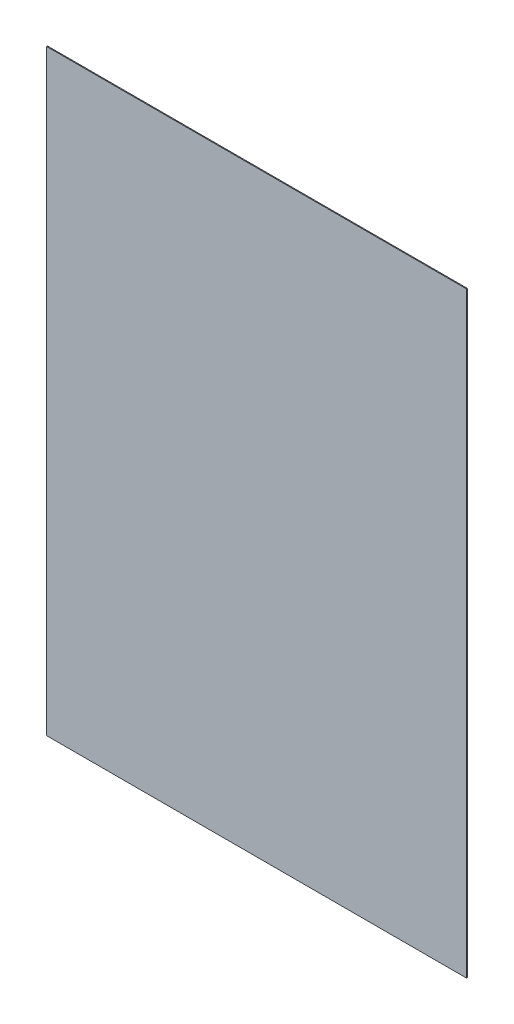
ISO-10303-21;
HEADER;
FILE_DESCRIPTION(('STEP AP214'),'2;1');
FILE_NAME('part.step','',(''),(''),'','','');
FILE_SCHEMA(('AUTOMOTIVE_DESIGN { 1 0 10303 214 1 1 1 1 }'));
ENDSEC;
DATA;
#1=APPLICATION_CONTEXT('core data for automotive mechanical design processes');
#2=APPLICATION_PROTOCOL_DEFINITION('international standard','automotive_design',2000,#1);
#3=PRODUCT_CONTEXT('',#1,'mechanical');
#4=PRODUCT('Part','Part','',(#3));
#5=PRODUCT_RELATED_PRODUCT_CATEGORY('part','',(#4));
#6=PRODUCT_DEFINITION_FORMATION('','',#4);
#7=PRODUCT_DEFINITION_CONTEXT('part definition',#1,'design');
#8=PRODUCT_DEFINITION('design','',#6,#7);
#9=PRODUCT_DEFINITION_SHAPE('','',#8);
#10=(LENGTH_UNIT() NAMED_UNIT(*) SI_UNIT(.MILLI.,.METRE.));
#11=(NAMED_UNIT(*) PLANE_ANGLE_UNIT() SI_UNIT($,.RADIAN.));
#12=(NAMED_UNIT(*) SI_UNIT($,.STERADIAN.) SOLID_ANGLE_UNIT());
#13=UNCERTAINTY_MEASURE_WITH_UNIT(LENGTH_MEASURE(1.E-05),#10,'distance_accuracy_value','');
#14=(GEOMETRIC_REPRESENTATION_CONTEXT(3) GLOBAL_UNCERTAINTY_ASSIGNED_CONTEXT((#13)) GLOBAL_UNIT_ASSIGNED_CONTEXT((#10,
#11,#12)) REPRESENTATION_CONTEXT('',''));
#15=CARTESIAN_POINT('',(0.,0.,0.));
#16=DIRECTION('',(0.,0.,1.));
#17=DIRECTION('',(1.,0.,0.));
#18=AXIS2_PLACEMENT_3D('',#15,#16,#17);
#19=CARTESIAN_POINT('',(450.,640.,1.9));
#20=DIRECTION('',(-1.,0.,0.));
#21=DIRECTION('',(0.,-1.,0.));
#22=AXIS2_PLACEMENT_3D('',#19,#20,#21);
#23=PLANE('',#22);
#24=DIRECTION('',(0.,1.,0.));
#25=VECTOR('',#24,1.);
#26=CARTESIAN_POINT('',(450.,640.,0.));
#27=LINE('',#26,#25);
#28=CARTESIAN_POINT('',(450.,-640.,0.));
#29=VERTEX_POINT('',#28);
#30=CARTESIAN_POINT('',(450.,640.,0.));
#31=VERTEX_POINT('',#30);
#32=EDGE_CURVE('E96',#29,#31,#27,.T.);
#33=ORIENTED_EDGE('',*,*,#32,.T.);
#34=DIRECTION('',(0.,0.,-1.));
#35=VECTOR('',#34,1.);
#36=CARTESIAN_POINT('',(450.,640.,1.9));
#37=LINE('',#36,#35);
#38=CARTESIAN_POINT('',(450.,640.,1.9));
#39=VERTEX_POINT('',#38);
#40=EDGE_CURVE('E11',#39,#31,#37,.T.);
#41=ORIENTED_EDGE('',*,*,#40,.F.);
#42=DIRECTION('',(0.,1.,0.));
#43=VECTOR('',#42,1.);
#44=CARTESIAN_POINT('',(450.,640.,1.9));
#45=LINE('',#44,#43);
#46=CARTESIAN_POINT('',(450.,-640.,1.9));
#47=VERTEX_POINT('',#46);
#48=EDGE_CURVE('E84',#47,#39,#45,.T.);
#49=ORIENTED_EDGE('',*,*,#48,.F.);
#50=DIRECTION('',(0.,0.,-1.));
#51=VECTOR('',#50,1.);
#52=CARTESIAN_POINT('',(450.,-640.,1.9));
#53=LINE('',#52,#51);
#54=EDGE_CURVE('E92',#47,#29,#53,.T.);
#55=ORIENTED_EDGE('',*,*,#54,.T.);
#56=EDGE_LOOP('',(#33,#41,#49,#55));
#57=FACE_BOUND('',#56,.T.);
#58=ADVANCED_FACE('F33',(#57),#23,.F.);
#59=CARTESIAN_POINT('',(-450.,640.,1.9));
#60=DIRECTION('',(0.,-1.,0.));
#61=DIRECTION('',(0.,0.,-1.));
#62=AXIS2_PLACEMENT_3D('',#59,#60,#61);
#63=PLANE('',#62);
#64=DIRECTION('',(-1.,0.,0.));
#65=VECTOR('',#64,1.);
#66=CARTESIAN_POINT('',(-450.,640.,0.));
#67=LINE('',#66,#65);
#68=CARTESIAN_POINT('',(-450.,640.,0.));
#69=VERTEX_POINT('',#68);
#70=EDGE_CURVE('E88',#31,#69,#67,.T.);
#71=ORIENTED_EDGE('',*,*,#70,.T.);
#72=DIRECTION('',(0.,0.,-1.));
#73=VECTOR('',#72,1.);
#74=CARTESIAN_POINT('',(-450.,640.,1.9));
#75=LINE('',#74,#73);
#76=CARTESIAN_POINT('',(-450.,640.,1.9));
#77=VERTEX_POINT('',#76);
#78=EDGE_CURVE('E41',#77,#69,#75,.T.);
#79=ORIENTED_EDGE('',*,*,#78,.F.);
#80=DIRECTION('',(-1.,0.,0.));
#81=VECTOR('',#80,1.);
#82=CARTESIAN_POINT('',(-450.,640.,1.9));
#83=LINE('',#82,#81);
#84=EDGE_CURVE('E79',#39,#77,#83,.T.);
#85=ORIENTED_EDGE('',*,*,#84,.F.);
#86=ORIENTED_EDGE('',*,*,#40,.T.);
#87=EDGE_LOOP('',(#71,#79,#85,#86));
#88=FACE_BOUND('',#87,.T.);
#89=ADVANCED_FACE('F87',(#88),#63,.F.);
#90=CARTESIAN_POINT('',(-450.,640.,1.9));
#91=DIRECTION('',(1.,0.,0.));
#92=DIRECTION('',(0.,1.,0.));
#93=AXIS2_PLACEMENT_3D('',#90,#91,#92);
#94=PLANE('',#93);
#95=DIRECTION('',(0.,-1.,0.));
#96=VECTOR('',#95,1.);
#97=CARTESIAN_POINT('',(-450.,640.,0.));
#98=LINE('',#97,#96);
#99=CARTESIAN_POINT('',(-450.,-640.,0.));
#100=VERTEX_POINT('',#99);
#101=EDGE_CURVE('E66',#69,#100,#98,.T.);
#102=ORIENTED_EDGE('',*,*,#101,.T.);
#103=DIRECTION('',(0.,0.,-1.));
#104=VECTOR('',#103,1.);
#105=CARTESIAN_POINT('',(-450.,-640.,1.9));
#106=LINE('',#105,#104);
#107=CARTESIAN_POINT('',(-450.,-640.,1.9));
#108=VERTEX_POINT('',#107);
#109=EDGE_CURVE('E89',#108,#100,#106,.T.);
#110=ORIENTED_EDGE('',*,*,#109,.F.);
#111=DIRECTION('',(0.,-1.,0.));
#112=VECTOR('',#111,1.);
#113=CARTESIAN_POINT('',(-450.,640.,1.9));
#114=LINE('',#113,#112);
#115=EDGE_CURVE('E82',#77,#108,#114,.T.);
#116=ORIENTED_EDGE('',*,*,#115,.F.);
#117=ORIENTED_EDGE('',*,*,#78,.T.);
#118=EDGE_LOOP('',(#102,#110,#116,#117));
#119=FACE_BOUND('',#118,.T.);
#120=ADVANCED_FACE('F90',(#119),#94,.F.);
#121=CARTESIAN_POINT('',(-450.,-640.,1.9));
#122=DIRECTION('',(0.,1.,0.));
#123=DIRECTION('',(0.,0.,1.));
#124=AXIS2_PLACEMENT_3D('',#121,#122,#123);
#125=PLANE('',#124);
#126=DIRECTION('',(1.,0.,0.));
#127=VECTOR('',#126,1.);
#128=CARTESIAN_POINT('',(-450.,-640.,0.));
#129=LINE('',#128,#127);
#130=EDGE_CURVE('E72',#100,#29,#129,.T.);
#131=ORIENTED_EDGE('',*,*,#130,.T.);
#132=ORIENTED_EDGE('',*,*,#54,.F.);
#133=DIRECTION('',(1.,0.,0.));
#134=VECTOR('',#133,1.);
#135=CARTESIAN_POINT('',(-450.,-640.,1.9));
#136=LINE('',#135,#134);
#137=EDGE_CURVE('E49',#108,#47,#136,.T.);
#138=ORIENTED_EDGE('',*,*,#137,.F.);
#139=ORIENTED_EDGE('',*,*,#109,.T.);
#140=EDGE_LOOP('',(#131,#132,#138,#139));
#141=FACE_BOUND('',#140,.T.);
#142=ADVANCED_FACE('F103',(#141),#125,.F.);
#143=CARTESIAN_POINT('',(0.,0.,1.9));
#144=DIRECTION('',(0.,0.,1.));
#145=DIRECTION('',(1.,0.,0.));
#146=AXIS2_PLACEMENT_3D('',#143,#144,#145);
#147=PLANE('',#146);
#148=ORIENTED_EDGE('',*,*,#48,.T.);
#149=ORIENTED_EDGE('',*,*,#84,.T.);
#150=ORIENTED_EDGE('',*,*,#115,.T.);
#151=ORIENTED_EDGE('',*,*,#137,.T.);
#152=EDGE_LOOP('',(#148,#149,#150,#151));
#153=FACE_BOUND('',#152,.T.);
#154=ADVANCED_FACE('F80',(#153),#147,.T.);
#155=CARTESIAN_POINT('',(0.,0.,0.));
#156=DIRECTION('',(0.,0.,1.));
#157=DIRECTION('',(1.,0.,0.));
#158=AXIS2_PLACEMENT_3D('',#155,#156,#157);
#159=PLANE('',#158);
#160=ORIENTED_EDGE('',*,*,#32,.F.);
#161=ORIENTED_EDGE('',*,*,#130,.F.);
#162=ORIENTED_EDGE('',*,*,#101,.F.);
#163=ORIENTED_EDGE('',*,*,#70,.F.);
#164=EDGE_LOOP('',(#160,#161,#162,#163));
#165=FACE_BOUND('',#164,.T.);
#166=ADVANCED_FACE('F106',(#165),#159,.F.);
#167=CLOSED_SHELL('',(#58,#89,#120,#142,#154,#166));
#168=MANIFOLD_SOLID_BREP('B2',#167);
#169=ADVANCED_BREP_SHAPE_REPRESENTATION('',(#18,#168),#14);
#170=SHAPE_DEFINITION_REPRESENTATION(#9,#169);
ENDSEC;
END-ISO-10303-21;
